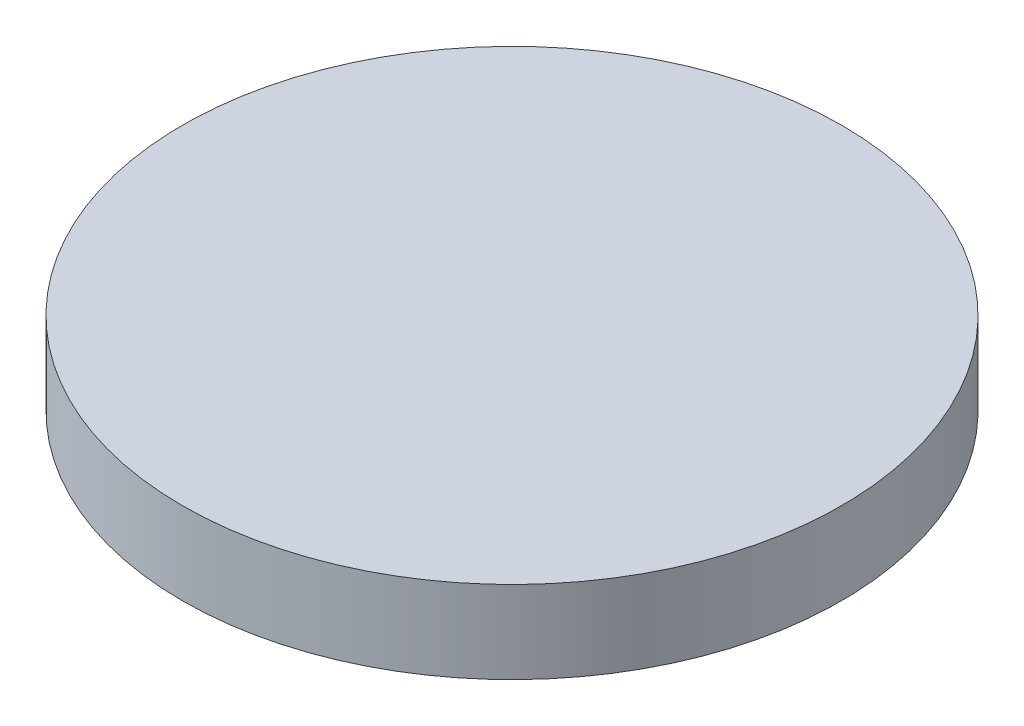
ISO-10303-21;
HEADER;
FILE_DESCRIPTION(('STEP AP214'),'2;1');
FILE_NAME('part.step','',(''),(''),'','','');
FILE_SCHEMA(('AUTOMOTIVE_DESIGN { 1 0 10303 214 1 1 1 1 }'));
ENDSEC;
DATA;
#1=APPLICATION_CONTEXT('core data for automotive mechanical design processes');
#2=APPLICATION_PROTOCOL_DEFINITION('international standard','automotive_design',2000,#1);
#3=PRODUCT_CONTEXT('',#1,'mechanical');
#4=PRODUCT('Part','Part','',(#3));
#5=PRODUCT_RELATED_PRODUCT_CATEGORY('part','',(#4));
#6=PRODUCT_DEFINITION_FORMATION('','',#4);
#7=PRODUCT_DEFINITION_CONTEXT('part definition',#1,'design');
#8=PRODUCT_DEFINITION('design','',#6,#7);
#9=PRODUCT_DEFINITION_SHAPE('','',#8);
#10=(LENGTH_UNIT() NAMED_UNIT(*) SI_UNIT(.MILLI.,.METRE.));
#11=(NAMED_UNIT(*) PLANE_ANGLE_UNIT() SI_UNIT($,.RADIAN.));
#12=(NAMED_UNIT(*) SI_UNIT($,.STERADIAN.) SOLID_ANGLE_UNIT());
#13=UNCERTAINTY_MEASURE_WITH_UNIT(LENGTH_MEASURE(1.E-05),#10,'distance_accuracy_value','');
#14=(GEOMETRIC_REPRESENTATION_CONTEXT(3) GLOBAL_UNCERTAINTY_ASSIGNED_CONTEXT((#13)) GLOBAL_UNIT_ASSIGNED_CONTEXT((#10,
#11,#12)) REPRESENTATION_CONTEXT('',''));
#15=CARTESIAN_POINT('',(0.,0.,0.));
#16=DIRECTION('',(0.,0.,1.));
#17=DIRECTION('',(1.,0.,0.));
#18=AXIS2_PLACEMENT_3D('',#15,#16,#17);
#19=CARTESIAN_POINT('',(0.,10.,0.));
#20=DIRECTION('',(0.,-1.,0.));
#21=DIRECTION('',(0.,0.,-1.));
#22=AXIS2_PLACEMENT_3D('',#19,#20,#21);
#23=CYLINDRICAL_SURFACE('',#22,40.);
#24=CARTESIAN_POINT('',(0.,10.,0.));
#25=DIRECTION('',(0.,1.,0.));
#26=DIRECTION('',(0.,0.,1.));
#27=AXIS2_PLACEMENT_3D('',#24,#25,#26);
#28=CIRCLE('',#27,40.);
#29=CARTESIAN_POINT('',(0.,10.,40.));
#30=VERTEX_POINT('',#29);
#31=EDGE_CURVE('E10',#30,#30,#28,.T.);
#32=ORIENTED_EDGE('',*,*,#31,.F.);
#33=EDGE_LOOP('',(#32));
#34=FACE_BOUND('',#33,.T.);
#35=CARTESIAN_POINT('',(0.,0.,0.));
#36=DIRECTION('',(0.,1.,0.));
#37=DIRECTION('',(0.,0.,1.));
#38=AXIS2_PLACEMENT_3D('',#35,#36,#37);
#39=CIRCLE('',#38,40.);
#40=CARTESIAN_POINT('',(0.,0.,40.));
#41=VERTEX_POINT('',#40);
#42=EDGE_CURVE('E36',#41,#41,#39,.T.);
#43=ORIENTED_EDGE('',*,*,#42,.T.);
#44=EDGE_LOOP('',(#43));
#45=FACE_BOUND('',#44,.T.);
#46=ADVANCED_FACE('F33',(#34,#45),#23,.T.);
#47=CARTESIAN_POINT('',(0.,10.,0.));
#48=DIRECTION('',(0.,1.,0.));
#49=DIRECTION('',(0.,0.,1.));
#50=AXIS2_PLACEMENT_3D('',#47,#48,#49);
#51=PLANE('',#50);
#52=ORIENTED_EDGE('',*,*,#31,.T.);
#53=EDGE_LOOP('',(#52));
#54=FACE_BOUND('',#53,.T.);
#55=ADVANCED_FACE('F48',(#54),#51,.T.);
#56=CARTESIAN_POINT('',(0.,0.,0.));
#57=DIRECTION('',(0.,1.,0.));
#58=DIRECTION('',(0.,0.,1.));
#59=AXIS2_PLACEMENT_3D('',#56,#57,#58);
#60=PLANE('',#59);
#61=ORIENTED_EDGE('',*,*,#42,.F.);
#62=EDGE_LOOP('',(#61));
#63=FACE_BOUND('',#62,.T.);
#64=ADVANCED_FACE('F46',(#63),#60,.F.);
#65=CLOSED_SHELL('',(#46,#55,#64));
#66=MANIFOLD_SOLID_BREP('B2',#65);
#67=ADVANCED_BREP_SHAPE_REPRESENTATION('',(#18,#66),#14);
#68=SHAPE_DEFINITION_REPRESENTATION(#9,#67);
ENDSEC;
END-ISO-10303-21;
